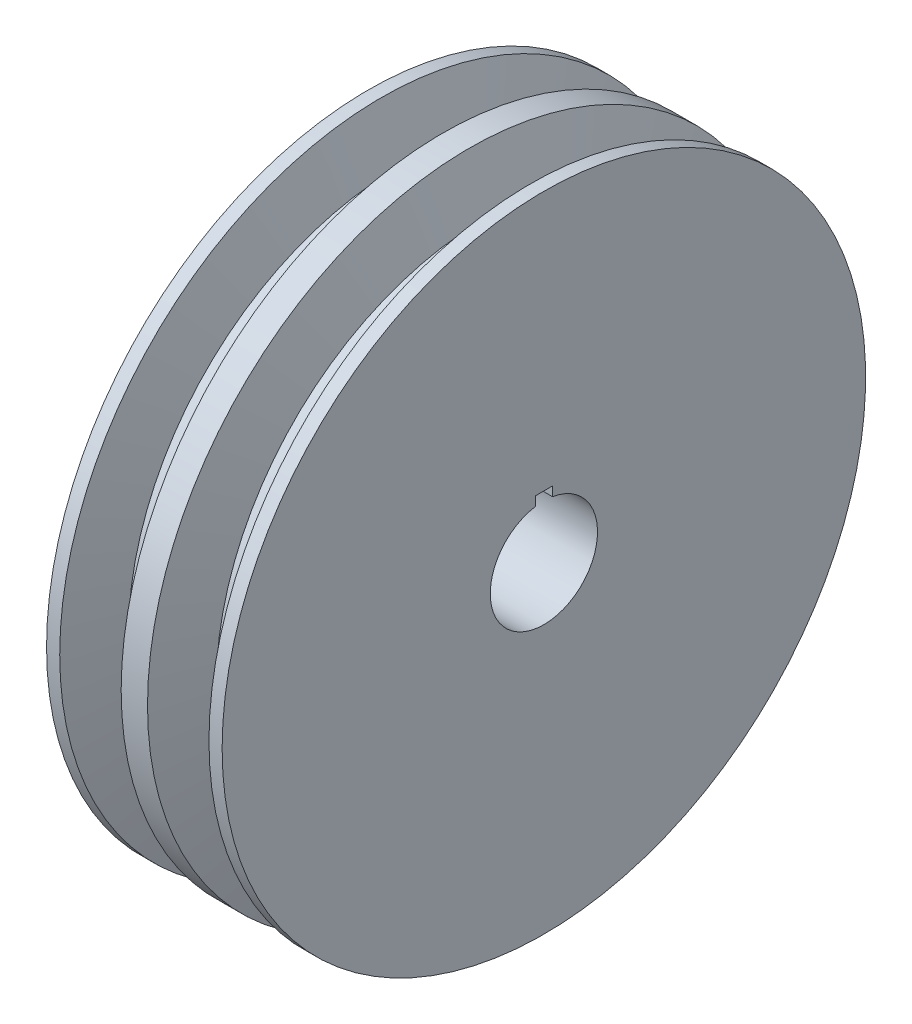
ISO-10303-21;
HEADER;
FILE_DESCRIPTION(('STEP AP214'),'2;1');
FILE_NAME('part.step','',(''),(''),'','','');
FILE_SCHEMA(('AUTOMOTIVE_DESIGN { 1 0 10303 214 1 1 1 1 }'));
ENDSEC;
DATA;
#1=APPLICATION_CONTEXT('core data for automotive mechanical design processes');
#2=APPLICATION_PROTOCOL_DEFINITION('international standard','automotive_design',2000,#1);
#3=PRODUCT_CONTEXT('',#1,'mechanical');
#4=PRODUCT('Part','Part','',(#3));
#5=PRODUCT_RELATED_PRODUCT_CATEGORY('part','',(#4));
#6=PRODUCT_DEFINITION_FORMATION('','',#4);
#7=PRODUCT_DEFINITION_CONTEXT('part definition',#1,'design');
#8=PRODUCT_DEFINITION('design','',#6,#7);
#9=PRODUCT_DEFINITION_SHAPE('','',#8);
#10=(LENGTH_UNIT() NAMED_UNIT(*) SI_UNIT(.MILLI.,.METRE.));
#11=(NAMED_UNIT(*) PLANE_ANGLE_UNIT() SI_UNIT($,.RADIAN.));
#12=(NAMED_UNIT(*) SI_UNIT($,.STERADIAN.) SOLID_ANGLE_UNIT());
#13=UNCERTAINTY_MEASURE_WITH_UNIT(LENGTH_MEASURE(1.E-05),#10,'distance_accuracy_value','');
#14=(GEOMETRIC_REPRESENTATION_CONTEXT(3) GLOBAL_UNCERTAINTY_ASSIGNED_CONTEXT((#13)) GLOBAL_UNIT_ASSIGNED_CONTEXT((#10,
#11,#12)) REPRESENTATION_CONTEXT('',''));
#15=CARTESIAN_POINT('',(0.,0.,0.));
#16=DIRECTION('',(0.,0.,1.));
#17=DIRECTION('',(1.,0.,0.));
#18=AXIS2_PLACEMENT_3D('',#15,#16,#17);
#19=CARTESIAN_POINT('',(1934.35360254101,0.,379.673045166987));
#20=DIRECTION('',(-1.,0.,0.));
#21=DIRECTION('',(0.,0.,1.));
#22=AXIS2_PLACEMENT_3D('',#19,#20,#21);
#23=PLANE('',#22);
#24=CARTESIAN_POINT('',(1934.35360254101,0.,379.673045166987));
#25=DIRECTION('',(-1.,0.,0.));
#26=DIRECTION('',(0.,0.,1.));
#27=AXIS2_PLACEMENT_3D('',#24,#25,#26);
#28=CIRCLE('',#27,150.);
#29=CARTESIAN_POINT('',(1934.35360254101,0.,529.673045166988));
#30=VERTEX_POINT('',#29);
#31=EDGE_CURVE('E107',#30,#30,#28,.T.);
#32=ORIENTED_EDGE('',*,*,#31,.T.);
#33=EDGE_LOOP('',(#32));
#34=FACE_BOUND('',#33,.T.);
#35=CARTESIAN_POINT('',(1934.35360254101,0.,379.673045166987));
#36=DIRECTION('',(-1.,0.,0.));
#37=DIRECTION('',(0.,0.,1.));
#38=AXIS2_PLACEMENT_3D('',#35,#36,#37);
#39=CIRCLE('',#38,25.);
#40=CARTESIAN_POINT('',(1934.35360254101,24.6779253585061,375.673045166987));
#41=VERTEX_POINT('',#40);
#42=CARTESIAN_POINT('',(1934.35360254101,24.6779253585061,383.673045166987));
#43=VERTEX_POINT('',#42);
#44=EDGE_CURVE('E101',#41,#43,#39,.T.);
#45=ORIENTED_EDGE('',*,*,#44,.F.);
#46=DIRECTION('',(0.,1.,0.));
#47=VECTOR('',#46,1.);
#48=CARTESIAN_POINT('',(1934.35360254101,0.,375.673045166987));
#49=LINE('',#48,#47);
#50=CARTESIAN_POINT('',(1934.35360254101,29.,375.673045166987));
#51=VERTEX_POINT('',#50);
#52=EDGE_CURVE('E96',#41,#51,#49,.T.);
#53=ORIENTED_EDGE('',*,*,#52,.T.);
#54=DIRECTION('',(0.,0.,1.));
#55=VECTOR('',#54,1.);
#56=CARTESIAN_POINT('',(1934.35360254101,29.,379.673045166987));
#57=LINE('',#56,#55);
#58=CARTESIAN_POINT('',(1934.35360254101,29.,383.673045166987));
#59=VERTEX_POINT('',#58);
#60=EDGE_CURVE('E56',#51,#59,#57,.T.);
#61=ORIENTED_EDGE('',*,*,#60,.T.);
#62=DIRECTION('',(0.,1.,0.));
#63=VECTOR('',#62,1.);
#64=CARTESIAN_POINT('',(1934.35360254101,0.,383.673045166987));
#65=LINE('',#64,#63);
#66=EDGE_CURVE('E93',#43,#59,#65,.T.);
#67=ORIENTED_EDGE('',*,*,#66,.F.);
#68=EDGE_LOOP('',(#45,#53,#61,#67));
#69=FACE_BOUND('',#68,.T.);
#70=ADVANCED_FACE('F33',(#34,#69),#23,.T.);
#71=CARTESIAN_POINT('',(2016.2089913541,150.,379.673045166988));
#72=DIRECTION('',(1.,0.,0.));
#73=DIRECTION('',(0.,0.,-1.));
#74=AXIS2_PLACEMENT_3D('',#71,#72,#73);
#75=PLANE('',#74);
#76=CARTESIAN_POINT('',(2016.2089913541,0.,379.673045166988));
#77=DIRECTION('',(-1.,0.,0.));
#78=DIRECTION('',(0.,0.,1.));
#79=AXIS2_PLACEMENT_3D('',#76,#77,#78);
#80=CIRCLE('',#79,150.);
#81=CARTESIAN_POINT('',(2016.2089913541,0.,529.673045166988));
#82=VERTEX_POINT('',#81);
#83=EDGE_CURVE('E104',#82,#82,#80,.T.);
#84=ORIENTED_EDGE('',*,*,#83,.F.);
#85=EDGE_LOOP('',(#84));
#86=FACE_BOUND('',#85,.T.);
#87=DIRECTION('',(0.,0.,-1.));
#88=VECTOR('',#87,1.);
#89=CARTESIAN_POINT('',(2016.2089913541,29.,2.71210033016997E-12));
#90=LINE('',#89,#88);
#91=CARTESIAN_POINT('',(2016.2089913541,29.,383.673045166988));
#92=VERTEX_POINT('',#91);
#93=CARTESIAN_POINT('',(2016.2089913541,29.,375.673045166987));
#94=VERTEX_POINT('',#93);
#95=EDGE_CURVE('E76',#92,#94,#90,.T.);
#96=ORIENTED_EDGE('',*,*,#95,.T.);
#97=DIRECTION('',(0.,-1.,0.));
#98=VECTOR('',#97,1.);
#99=CARTESIAN_POINT('',(2016.2089913541,0.,375.673045166987));
#100=LINE('',#99,#98);
#101=CARTESIAN_POINT('',(2016.2089913541,24.6779253585061,375.673045166987));
#102=VERTEX_POINT('',#101);
#103=EDGE_CURVE('E82',#94,#102,#100,.T.);
#104=ORIENTED_EDGE('',*,*,#103,.T.);
#105=CARTESIAN_POINT('',(2016.2089913541,0.,379.673045166988));
#106=DIRECTION('',(1.,0.,0.));
#107=DIRECTION('',(0.,0.,-1.));
#108=AXIS2_PLACEMENT_3D('',#105,#106,#107);
#109=CIRCLE('',#108,25.);
#110=CARTESIAN_POINT('',(2016.2089913541,24.6779253585061,383.673045166988));
#111=VERTEX_POINT('',#110);
#112=EDGE_CURVE('E99',#111,#102,#109,.T.);
#113=ORIENTED_EDGE('',*,*,#112,.F.);
#114=DIRECTION('',(0.,-1.,0.));
#115=VECTOR('',#114,1.);
#116=CARTESIAN_POINT('',(2016.2089913541,0.,383.673045166988));
#117=LINE('',#116,#115);
#118=EDGE_CURVE('E48',#92,#111,#117,.T.);
#119=ORIENTED_EDGE('',*,*,#118,.F.);
#120=EDGE_LOOP('',(#96,#104,#113,#119));
#121=FACE_BOUND('',#120,.T.);
#122=ADVANCED_FACE('F89',(#86,#121),#75,.T.);
#123=CARTESIAN_POINT('',(1896.2089913541,0.,379.673045166987));
#124=DIRECTION('',(1.,0.,0.));
#125=DIRECTION('',(0.,0.,-1.));
#126=AXIS2_PLACEMENT_3D('',#123,#124,#125);
#127=CYLINDRICAL_SURFACE('',#126,25.);
#128=DIRECTION('',(1.,0.,0.));
#129=VECTOR('',#128,1.);
#130=CARTESIAN_POINT('',(1896.2089913541,24.6779253585061,375.673045166987));
#131=LINE('',#130,#129);
#132=EDGE_CURVE('E11',#41,#102,#131,.T.);
#133=ORIENTED_EDGE('',*,*,#132,.F.);
#134=ORIENTED_EDGE('',*,*,#44,.T.);
#135=DIRECTION('',(1.,0.,0.));
#136=VECTOR('',#135,1.);
#137=CARTESIAN_POINT('',(1896.2089913541,24.6779253585061,383.673045166987));
#138=LINE('',#137,#136);
#139=EDGE_CURVE('E41',#43,#111,#138,.T.);
#140=ORIENTED_EDGE('',*,*,#139,.T.);
#141=ORIENTED_EDGE('',*,*,#112,.T.);
#142=EDGE_LOOP('',(#133,#134,#140,#141));
#143=FACE_BOUND('',#142,.T.);
#144=ADVANCED_FACE('F134',(#143),#127,.F.);
#145=CARTESIAN_POINT('',(2016.2089913541,0.,379.673045166988));
#146=DIRECTION('',(-1.,0.,0.));
#147=DIRECTION('',(0.,0.,1.));
#148=AXIS2_PLACEMENT_3D('',#145,#146,#147);
#149=CYLINDRICAL_SURFACE('',#148,150.);
#150=ORIENTED_EDGE('',*,*,#83,.T.);
#151=EDGE_LOOP('',(#150));
#152=FACE_BOUND('',#151,.T.);
#153=CARTESIAN_POINT('',(2010.06983719312,0.,379.673045166988));
#154=DIRECTION('',(-1.,0.,0.));
#155=DIRECTION('',(0.,0.,1.));
#156=AXIS2_PLACEMENT_3D('',#153,#154,#155);
#157=CIRCLE('',#156,150.);
#158=CARTESIAN_POINT('',(2010.06983719312,0.,529.673045166987));
#159=VERTEX_POINT('',#158);
#160=EDGE_CURVE('E131',#159,#159,#157,.T.);
#161=ORIENTED_EDGE('',*,*,#160,.F.);
#162=EDGE_LOOP('',(#161));
#163=FACE_BOUND('',#162,.T.);
#164=ADVANCED_FACE('F35',(#152,#163),#149,.T.);
#165=CARTESIAN_POINT('',(2002.56212605225,0.,379.673045166988));
#166=DIRECTION('',(1.,0.,0.));
#167=DIRECTION('',(0.,0.,-1.));
#168=AXIS2_PLACEMENT_3D('',#165,#166,#167);
#169=CONICAL_SURFACE('',#168,125.443383356071,1.27409035395586);
#170=ORIENTED_EDGE('',*,*,#160,.T.);
#171=EDGE_LOOP('',(#170));
#172=FACE_BOUND('',#171,.T.);
#173=CARTESIAN_POINT('',(2002.56212605225,0.,379.673045166988));
#174=DIRECTION('',(-1.,0.,0.));
#175=DIRECTION('',(0.,0.,1.));
#176=AXIS2_PLACEMENT_3D('',#173,#174,#175);
#177=CIRCLE('',#176,125.443383356071);
#178=CARTESIAN_POINT('',(2002.56212605225,0.,505.116428523059));
#179=VERTEX_POINT('',#178);
#180=EDGE_CURVE('E128',#179,#179,#177,.T.);
#181=ORIENTED_EDGE('',*,*,#180,.F.);
#182=EDGE_LOOP('',(#181));
#183=FACE_BOUND('',#182,.T.);
#184=ADVANCED_FACE('F176',(#172,#183),#169,.T.);
#185=CARTESIAN_POINT('',(2016.2089913541,0.,379.673045166988));
#186=DIRECTION('',(-1.,0.,0.));
#187=DIRECTION('',(0.,0.,1.));
#188=AXIS2_PLACEMENT_3D('',#185,#186,#187);
#189=CYLINDRICAL_SURFACE('',#188,125.443383356071);
#190=ORIENTED_EDGE('',*,*,#180,.T.);
#191=EDGE_LOOP('',(#190));
#192=FACE_BOUND('',#191,.T.);
#193=CARTESIAN_POINT('',(1988.92816224941,0.,379.673045166987));
#194=DIRECTION('',(-1.,0.,0.));
#195=DIRECTION('',(0.,0.,1.));
#196=AXIS2_PLACEMENT_3D('',#193,#194,#195);
#197=CIRCLE('',#196,125.443383356071);
#198=CARTESIAN_POINT('',(1988.92816224941,0.,505.116428523059));
#199=VERTEX_POINT('',#198);
#200=EDGE_CURVE('E125',#199,#199,#197,.T.);
#201=ORIENTED_EDGE('',*,*,#200,.F.);
#202=EDGE_LOOP('',(#201));
#203=FACE_BOUND('',#202,.T.);
#204=ADVANCED_FACE('F173',(#192,#203),#189,.T.);
#205=CARTESIAN_POINT('',(1981.42045110854,0.,379.673045166987));
#206=DIRECTION('',(-1.,0.,0.));
#207=DIRECTION('',(0.,0.,1.));
#208=AXIS2_PLACEMENT_3D('',#205,#206,#207);
#209=CONICAL_SURFACE('',#208,150.,1.27409035395586);
#210=ORIENTED_EDGE('',*,*,#200,.T.);
#211=EDGE_LOOP('',(#210));
#212=FACE_BOUND('',#211,.T.);
#213=CARTESIAN_POINT('',(1981.42045110854,0.,379.673045166987));
#214=DIRECTION('',(-1.,0.,0.));
#215=DIRECTION('',(0.,0.,1.));
#216=AXIS2_PLACEMENT_3D('',#213,#214,#215);
#217=CIRCLE('',#216,150.);
#218=CARTESIAN_POINT('',(1981.42045110854,0.,529.673045166988));
#219=VERTEX_POINT('',#218);
#220=EDGE_CURVE('E122',#219,#219,#217,.T.);
#221=ORIENTED_EDGE('',*,*,#220,.F.);
#222=EDGE_LOOP('',(#221));
#223=FACE_BOUND('',#222,.T.);
#224=ADVANCED_FACE('F169',(#212,#223),#209,.T.);
#225=CARTESIAN_POINT('',(2016.2089913541,0.,379.673045166988));
#226=DIRECTION('',(-1.,0.,0.));
#227=DIRECTION('',(0.,0.,1.));
#228=AXIS2_PLACEMENT_3D('',#225,#226,#227);
#229=CYLINDRICAL_SURFACE('',#228,150.);
#230=ORIENTED_EDGE('',*,*,#220,.T.);
#231=EDGE_LOOP('',(#230));
#232=FACE_BOUND('',#231,.T.);
#233=CARTESIAN_POINT('',(1969.14214278657,0.,379.673045166987));
#234=DIRECTION('',(-1.,0.,0.));
#235=DIRECTION('',(0.,0.,1.));
#236=AXIS2_PLACEMENT_3D('',#233,#234,#235);
#237=CIRCLE('',#236,150.);
#238=CARTESIAN_POINT('',(1969.14214278657,0.,529.673045166988));
#239=VERTEX_POINT('',#238);
#240=EDGE_CURVE('E119',#239,#239,#237,.T.);
#241=ORIENTED_EDGE('',*,*,#240,.F.);
#242=EDGE_LOOP('',(#241));
#243=FACE_BOUND('',#242,.T.);
#244=ADVANCED_FACE('F165',(#232,#243),#229,.T.);
#245=CARTESIAN_POINT('',(1961.63443164571,0.,379.673045166987));
#246=DIRECTION('',(1.,0.,0.));
#247=DIRECTION('',(0.,0.,-1.));
#248=AXIS2_PLACEMENT_3D('',#245,#246,#247);
#249=CONICAL_SURFACE('',#248,125.443383356071,1.27409035395586);
#250=ORIENTED_EDGE('',*,*,#240,.T.);
#251=EDGE_LOOP('',(#250));
#252=FACE_BOUND('',#251,.T.);
#253=CARTESIAN_POINT('',(1961.63443164571,0.,379.673045166987));
#254=DIRECTION('',(-1.,0.,0.));
#255=DIRECTION('',(0.,0.,1.));
#256=AXIS2_PLACEMENT_3D('',#253,#254,#255);
#257=CIRCLE('',#256,125.443383356071);
#258=CARTESIAN_POINT('',(1961.63443164571,0.,505.116428523059));
#259=VERTEX_POINT('',#258);
#260=EDGE_CURVE('E116',#259,#259,#257,.T.);
#261=ORIENTED_EDGE('',*,*,#260,.F.);
#262=EDGE_LOOP('',(#261));
#263=FACE_BOUND('',#262,.T.);
#264=ADVANCED_FACE('F161',(#252,#263),#249,.T.);
#265=CARTESIAN_POINT('',(2016.2089913541,0.,379.673045166988));
#266=DIRECTION('',(-1.,0.,0.));
#267=DIRECTION('',(0.,0.,1.));
#268=AXIS2_PLACEMENT_3D('',#265,#266,#267);
#269=CYLINDRICAL_SURFACE('',#268,125.443383356071);
#270=ORIENTED_EDGE('',*,*,#260,.T.);
#271=EDGE_LOOP('',(#270));
#272=FACE_BOUND('',#271,.T.);
#273=CARTESIAN_POINT('',(1948.00046784286,0.,379.673045166987));
#274=DIRECTION('',(-1.,0.,0.));
#275=DIRECTION('',(0.,0.,1.));
#276=AXIS2_PLACEMENT_3D('',#273,#274,#275);
#277=CIRCLE('',#276,125.443383356071);
#278=CARTESIAN_POINT('',(1948.00046784286,0.,505.116428523059));
#279=VERTEX_POINT('',#278);
#280=EDGE_CURVE('E113',#279,#279,#277,.T.);
#281=ORIENTED_EDGE('',*,*,#280,.F.);
#282=EDGE_LOOP('',(#281));
#283=FACE_BOUND('',#282,.T.);
#284=ADVANCED_FACE('F157',(#272,#283),#269,.T.);
#285=CARTESIAN_POINT('',(1940.49275670199,0.,379.673045166987));
#286=DIRECTION('',(-1.,0.,0.));
#287=DIRECTION('',(0.,0.,1.));
#288=AXIS2_PLACEMENT_3D('',#285,#286,#287);
#289=CONICAL_SURFACE('',#288,150.,1.27409035395586);
#290=ORIENTED_EDGE('',*,*,#280,.T.);
#291=EDGE_LOOP('',(#290));
#292=FACE_BOUND('',#291,.T.);
#293=CARTESIAN_POINT('',(1940.49275670199,0.,379.673045166987));
#294=DIRECTION('',(-1.,0.,0.));
#295=DIRECTION('',(0.,0.,1.));
#296=AXIS2_PLACEMENT_3D('',#293,#294,#295);
#297=CIRCLE('',#296,150.);
#298=CARTESIAN_POINT('',(1940.49275670199,0.,529.673045166988));
#299=VERTEX_POINT('',#298);
#300=EDGE_CURVE('E110',#299,#299,#297,.T.);
#301=ORIENTED_EDGE('',*,*,#300,.F.);
#302=EDGE_LOOP('',(#301));
#303=FACE_BOUND('',#302,.T.);
#304=ADVANCED_FACE('F153',(#292,#303),#289,.T.);
#305=CARTESIAN_POINT('',(2016.2089913541,0.,379.673045166988));
#306=DIRECTION('',(-1.,0.,0.));
#307=DIRECTION('',(0.,0.,1.));
#308=AXIS2_PLACEMENT_3D('',#305,#306,#307);
#309=CYLINDRICAL_SURFACE('',#308,150.);
#310=ORIENTED_EDGE('',*,*,#300,.T.);
#311=EDGE_LOOP('',(#310));
#312=FACE_BOUND('',#311,.T.);
#313=ORIENTED_EDGE('',*,*,#31,.F.);
#314=EDGE_LOOP('',(#313));
#315=FACE_BOUND('',#314,.T.);
#316=ADVANCED_FACE('F150',(#312,#315),#309,.T.);
#317=CARTESIAN_POINT('',(1896.2089913541,0.,375.673045166987));
#318=DIRECTION('',(0.,0.,1.));
#319=DIRECTION('',(1.,0.,0.));
#320=AXIS2_PLACEMENT_3D('',#317,#318,#319);
#321=PLANE('',#320);
#322=ORIENTED_EDGE('',*,*,#132,.T.);
#323=ORIENTED_EDGE('',*,*,#103,.F.);
#324=DIRECTION('',(1.,0.,0.));
#325=VECTOR('',#324,1.);
#326=CARTESIAN_POINT('',(1896.2089913541,29.,375.673045166987));
#327=LINE('',#326,#325);
#328=EDGE_CURVE('E72',#51,#94,#327,.T.);
#329=ORIENTED_EDGE('',*,*,#328,.F.);
#330=ORIENTED_EDGE('',*,*,#52,.F.);
#331=EDGE_LOOP('',(#322,#323,#329,#330));
#332=FACE_BOUND('',#331,.T.);
#333=ADVANCED_FACE('F83',(#332),#321,.T.);
#334=CARTESIAN_POINT('',(1896.2089913541,0.,383.673045166987));
#335=DIRECTION('',(0.,0.,1.));
#336=DIRECTION('',(1.,0.,0.));
#337=AXIS2_PLACEMENT_3D('',#334,#335,#336);
#338=PLANE('',#337);
#339=ORIENTED_EDGE('',*,*,#66,.T.);
#340=DIRECTION('',(1.,0.,0.));
#341=VECTOR('',#340,1.);
#342=CARTESIAN_POINT('',(1896.2089913541,29.,383.673045166987));
#343=LINE('',#342,#341);
#344=EDGE_CURVE('E79',#59,#92,#343,.T.);
#345=ORIENTED_EDGE('',*,*,#344,.T.);
#346=ORIENTED_EDGE('',*,*,#118,.T.);
#347=ORIENTED_EDGE('',*,*,#139,.F.);
#348=EDGE_LOOP('',(#339,#345,#346,#347));
#349=FACE_BOUND('',#348,.T.);
#350=ADVANCED_FACE('F137',(#349),#338,.F.);
#351=CARTESIAN_POINT('',(1896.2089913541,29.,2.54934163475993E-12));
#352=DIRECTION('',(0.,-1.,0.));
#353=DIRECTION('',(0.,0.,-1.));
#354=AXIS2_PLACEMENT_3D('',#351,#352,#353);
#355=PLANE('',#354);
#356=ORIENTED_EDGE('',*,*,#328,.T.);
#357=ORIENTED_EDGE('',*,*,#95,.F.);
#358=ORIENTED_EDGE('',*,*,#344,.F.);
#359=ORIENTED_EDGE('',*,*,#60,.F.);
#360=EDGE_LOOP('',(#356,#357,#358,#359));
#361=FACE_BOUND('',#360,.T.);
#362=ADVANCED_FACE('F74',(#361),#355,.T.);
#363=CLOSED_SHELL('',(#70,#122,#144,#164,#184,#204,#224,#244,#264,#284,#304,#316,#333,#350,#362));
#364=MANIFOLD_SOLID_BREP('B2',#363);
#365=ADVANCED_BREP_SHAPE_REPRESENTATION('',(#18,#364),#14);
#366=SHAPE_DEFINITION_REPRESENTATION(#9,#365);
ENDSEC;
END-ISO-10303-21;
